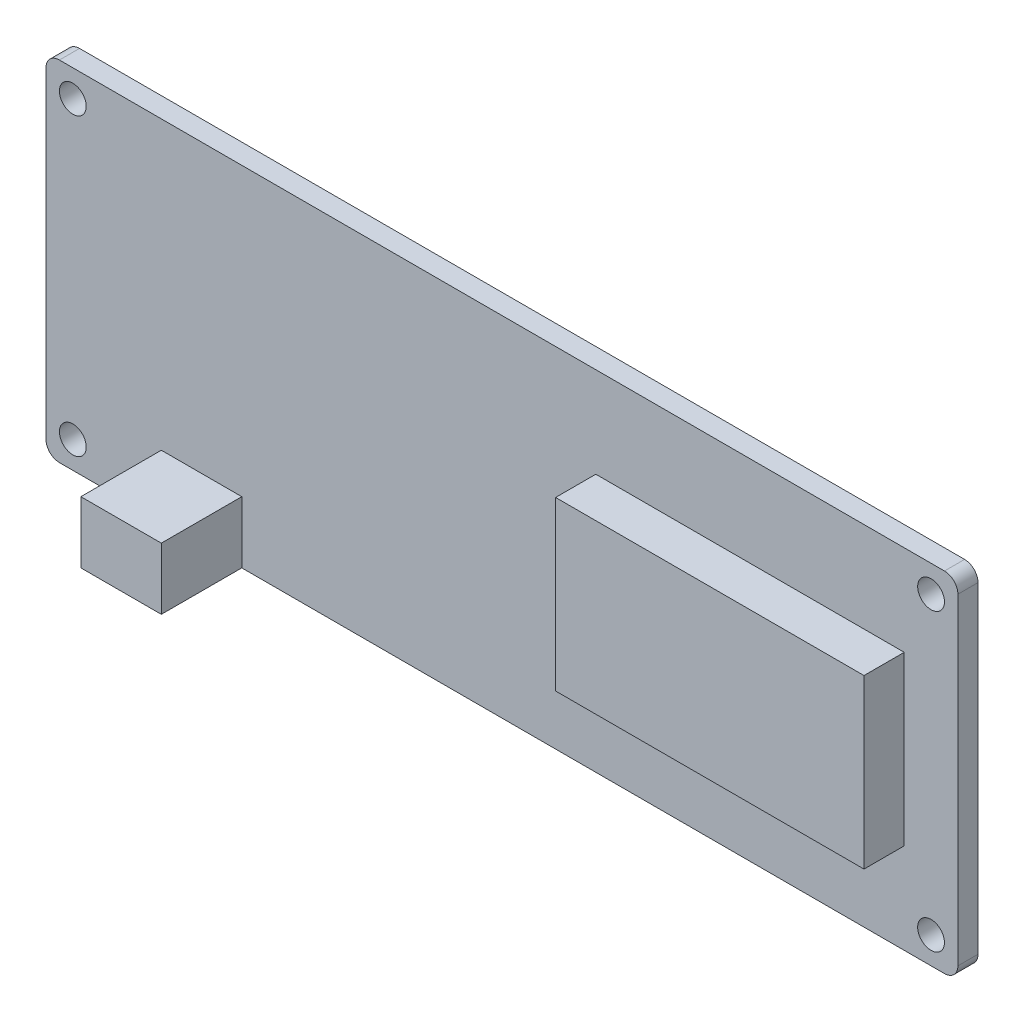
ISO-10303-21;
HEADER;
FILE_DESCRIPTION(('STEP AP214'),'2;1');
FILE_NAME('part.step','',(''),(''),'','','');
FILE_SCHEMA(('AUTOMOTIVE_DESIGN { 1 0 10303 214 1 1 1 1 }'));
ENDSEC;
DATA;
#1=APPLICATION_CONTEXT('core data for automotive mechanical design processes');
#2=APPLICATION_PROTOCOL_DEFINITION('international standard','automotive_design',2000,#1);
#3=PRODUCT_CONTEXT('',#1,'mechanical');
#4=PRODUCT('Part','Part','',(#3));
#5=PRODUCT_RELATED_PRODUCT_CATEGORY('part','',(#4));
#6=PRODUCT_DEFINITION_FORMATION('','',#4);
#7=PRODUCT_DEFINITION_CONTEXT('part definition',#1,'design');
#8=PRODUCT_DEFINITION('design','',#6,#7);
#9=PRODUCT_DEFINITION_SHAPE('','',#8);
#10=(LENGTH_UNIT() NAMED_UNIT(*) SI_UNIT(.MILLI.,.METRE.));
#11=(NAMED_UNIT(*) PLANE_ANGLE_UNIT() SI_UNIT($,.RADIAN.));
#12=(NAMED_UNIT(*) SI_UNIT($,.STERADIAN.) SOLID_ANGLE_UNIT());
#13=UNCERTAINTY_MEASURE_WITH_UNIT(LENGTH_MEASURE(1.E-05),#10,'distance_accuracy_value','');
#14=(GEOMETRIC_REPRESENTATION_CONTEXT(3) GLOBAL_UNCERTAINTY_ASSIGNED_CONTEXT((#13)) GLOBAL_UNIT_ASSIGNED_CONTEXT((#10,
#11,#12)) REPRESENTATION_CONTEXT('',''));
#15=CARTESIAN_POINT('',(0.,0.,0.));
#16=DIRECTION('',(0.,0.,1.));
#17=DIRECTION('',(1.,0.,0.));
#18=AXIS2_PLACEMENT_3D('',#15,#16,#17);
#19=CARTESIAN_POINT('',(32.4983494870785,-33.0565397486196,1.5));
#20=DIRECTION('',(0.,0.,-1.));
#21=DIRECTION('',(-1.,0.,0.));
#22=AXIS2_PLACEMENT_3D('',#19,#20,#21);
#23=PLANE('',#22);
#24=DIRECTION('',(0.,-1.,0.));
#25=VECTOR('',#24,1.);
#26=CARTESIAN_POINT('',(6.49834948707853,-38.8065397486196,1.5));
#27=LINE('',#26,#25);
#28=CARTESIAN_POINT('',(6.49834948707853,-38.8065397486196,1.5));
#29=VERTEX_POINT('',#28);
#30=CARTESIAN_POINT('',(6.49834948707853,-51.3065397486196,1.5));
#31=VERTEX_POINT('',#30);
#32=EDGE_CURVE('E168',#29,#31,#27,.T.);
#33=ORIENTED_EDGE('',*,*,#32,.F.);
#34=DIRECTION('',(-1.,0.,0.));
#35=VECTOR('',#34,1.);
#36=CARTESIAN_POINT('',(6.49834948707853,-38.8065397486196,1.5));
#37=LINE('',#36,#35);
#38=CARTESIAN_POINT('',(29.4983494870785,-38.8065397486196,1.5));
#39=VERTEX_POINT('',#38);
#40=EDGE_CURVE('E181',#39,#29,#37,.T.);
#41=ORIENTED_EDGE('',*,*,#40,.F.);
#42=DIRECTION('',(0.,1.,0.));
#43=VECTOR('',#42,1.);
#44=CARTESIAN_POINT('',(29.4983494870785,-38.8065397486196,1.5));
#45=LINE('',#44,#43);
#46=CARTESIAN_POINT('',(29.4983494870785,-51.3065397486196,1.5));
#47=VERTEX_POINT('',#46);
#48=EDGE_CURVE('E190',#47,#39,#45,.T.);
#49=ORIENTED_EDGE('',*,*,#48,.F.);
#50=DIRECTION('',(1.,0.,0.));
#51=VECTOR('',#50,1.);
#52=CARTESIAN_POINT('',(6.49834948707853,-51.3065397486196,1.5));
#53=LINE('',#52,#51);
#54=EDGE_CURVE('E171',#31,#47,#53,.T.);
#55=ORIENTED_EDGE('',*,*,#54,.F.);
#56=EDGE_LOOP('',(#33,#41,#49,#55));
#57=FACE_BOUND('',#56,.T.);
#58=CARTESIAN_POINT('',(-32.5016505129215,-34.0565397486196,1.5));
#59=DIRECTION('',(0.,0.,1.));
#60=DIRECTION('',(1.,0.,0.));
#61=AXIS2_PLACEMENT_3D('',#58,#59,#60);
#62=CIRCLE('',#61,1.00000000000001);
#63=CARTESIAN_POINT('',(-31.5016505129215,-34.0565397486196,1.5));
#64=VERTEX_POINT('',#63);
#65=EDGE_CURVE('E225',#64,#64,#62,.T.);
#66=ORIENTED_EDGE('',*,*,#65,.F.);
#67=EDGE_LOOP('',(#66));
#68=FACE_BOUND('',#67,.T.);
#69=CARTESIAN_POINT('',(-32.5016505129215,-56.0565397486196,1.5));
#70=DIRECTION('',(0.,0.,1.));
#71=DIRECTION('',(1.,0.,0.));
#72=AXIS2_PLACEMENT_3D('',#69,#70,#71);
#73=CIRCLE('',#72,0.999999999999998);
#74=CARTESIAN_POINT('',(-31.5016505129215,-56.0565397486196,1.5));
#75=VERTEX_POINT('',#74);
#76=EDGE_CURVE('E219',#75,#75,#73,.T.);
#77=ORIENTED_EDGE('',*,*,#76,.F.);
#78=EDGE_LOOP('',(#77));
#79=FACE_BOUND('',#78,.T.);
#80=CARTESIAN_POINT('',(31.4983494870785,-56.0565397486196,1.5));
#81=DIRECTION('',(0.,0.,1.));
#82=DIRECTION('',(1.,0.,0.));
#83=AXIS2_PLACEMENT_3D('',#80,#81,#82);
#84=CIRCLE('',#83,0.999999999999998);
#85=CARTESIAN_POINT('',(32.4983494870785,-56.0565397486196,1.5));
#86=VERTEX_POINT('',#85);
#87=EDGE_CURVE('E213',#86,#86,#84,.T.);
#88=ORIENTED_EDGE('',*,*,#87,.F.);
#89=EDGE_LOOP('',(#88));
#90=FACE_BOUND('',#89,.T.);
#91=CARTESIAN_POINT('',(31.4983494870785,-34.0565397486196,1.5));
#92=DIRECTION('',(0.,0.,1.));
#93=DIRECTION('',(1.,0.,0.));
#94=AXIS2_PLACEMENT_3D('',#91,#92,#93);
#95=CIRCLE('',#94,0.999999999999998);
#96=CARTESIAN_POINT('',(32.4983494870785,-34.0565397486196,1.5));
#97=VERTEX_POINT('',#96);
#98=EDGE_CURVE('E207',#97,#97,#95,.T.);
#99=ORIENTED_EDGE('',*,*,#98,.F.);
#100=EDGE_LOOP('',(#99));
#101=FACE_BOUND('',#100,.T.);
#102=DIRECTION('',(0.,-1.,0.));
#103=VECTOR('',#102,1.);
#104=CARTESIAN_POINT('',(-25.9016505129215,-53.4565397486196,1.5));
#105=LINE('',#104,#103);
#106=CARTESIAN_POINT('',(-25.9016505129215,-53.4565397486196,1.5));
#107=VERTEX_POINT('',#106);
#108=CARTESIAN_POINT('',(-25.9016505129215,-58.0565397486196,1.5));
#109=VERTEX_POINT('',#108);
#110=EDGE_CURVE('E49',#107,#109,#105,.T.);
#111=ORIENTED_EDGE('',*,*,#110,.F.);
#112=DIRECTION('',(-1.,0.,0.));
#113=VECTOR('',#112,1.);
#114=CARTESIAN_POINT('',(-25.9016505129215,-53.4565397486196,1.5));
#115=LINE('',#114,#113);
#116=CARTESIAN_POINT('',(-19.9016505129215,-53.4565397486196,1.5));
#117=VERTEX_POINT('',#116);
#118=EDGE_CURVE('E53',#117,#107,#115,.T.);
#119=ORIENTED_EDGE('',*,*,#118,.F.);
#120=DIRECTION('',(0.,1.,0.));
#121=VECTOR('',#120,1.);
#122=CARTESIAN_POINT('',(-19.9016505129215,-53.4565397486196,1.5));
#123=LINE('',#122,#121);
#124=CARTESIAN_POINT('',(-19.9016505129215,-58.0565397486196,1.5));
#125=VERTEX_POINT('',#124);
#126=EDGE_CURVE('E320',#125,#117,#123,.T.);
#127=ORIENTED_EDGE('',*,*,#126,.F.);
#128=DIRECTION('',(1.,0.,0.));
#129=VECTOR('',#128,1.);
#130=CARTESIAN_POINT('',(-33.5016505129215,-58.0565397486196,1.5));
#131=LINE('',#130,#129);
#132=CARTESIAN_POINT('',(32.4983494870785,-58.0565397486196,1.5));
#133=VERTEX_POINT('',#132);
#134=EDGE_CURVE('E243',#125,#133,#131,.T.);
#135=ORIENTED_EDGE('',*,*,#134,.T.);
#136=CARTESIAN_POINT('',(32.4983494870785,-57.0565397486196,1.5));
#137=DIRECTION('',(0.,0.,1.));
#138=DIRECTION('',(1.,0.,0.));
#139=AXIS2_PLACEMENT_3D('',#136,#137,#138);
#140=CIRCLE('',#139,1.);
#141=CARTESIAN_POINT('',(33.4983494870785,-57.0565397486196,1.5));
#142=VERTEX_POINT('',#141);
#143=EDGE_CURVE('E246',#133,#142,#140,.T.);
#144=ORIENTED_EDGE('',*,*,#143,.T.);
#145=DIRECTION('',(0.,1.,0.));
#146=VECTOR('',#145,1.);
#147=CARTESIAN_POINT('',(33.4983494870785,-57.0565397486195,1.5));
#148=LINE('',#147,#146);
#149=CARTESIAN_POINT('',(33.4983494870785,-33.0565397486196,1.5));
#150=VERTEX_POINT('',#149);
#151=EDGE_CURVE('E248',#142,#150,#148,.T.);
#152=ORIENTED_EDGE('',*,*,#151,.T.);
#153=CARTESIAN_POINT('',(32.4983494870785,-33.0565397486196,1.5));
#154=DIRECTION('',(0.,0.,1.));
#155=DIRECTION('',(-1.,0.,0.));
#156=AXIS2_PLACEMENT_3D('',#153,#154,#155);
#157=CIRCLE('',#156,1.);
#158=CARTESIAN_POINT('',(32.4983494870785,-32.0565397486196,1.5));
#159=VERTEX_POINT('',#158);
#160=EDGE_CURVE('E231',#150,#159,#157,.T.);
#161=ORIENTED_EDGE('',*,*,#160,.T.);
#162=DIRECTION('',(-1.,0.,0.));
#163=VECTOR('',#162,1.);
#164=CARTESIAN_POINT('',(-33.5016505129215,-32.0565397486196,1.5));
#165=LINE('',#164,#163);
#166=CARTESIAN_POINT('',(-33.5016505129215,-32.0565397486196,1.5));
#167=VERTEX_POINT('',#166);
#168=EDGE_CURVE('E234',#159,#167,#165,.T.);
#169=ORIENTED_EDGE('',*,*,#168,.T.);
#170=CARTESIAN_POINT('',(-33.5016505129215,-33.0565397486196,1.5));
#171=DIRECTION('',(0.,0.,1.));
#172=DIRECTION('',(-1.,0.,0.));
#173=AXIS2_PLACEMENT_3D('',#170,#171,#172);
#174=CIRCLE('',#173,1.);
#175=CARTESIAN_POINT('',(-34.5016505129215,-33.0565397486196,1.5));
#176=VERTEX_POINT('',#175);
#177=EDGE_CURVE('E237',#167,#176,#174,.T.);
#178=ORIENTED_EDGE('',*,*,#177,.T.);
#179=DIRECTION('',(0.,-1.,0.));
#180=VECTOR('',#179,1.);
#181=CARTESIAN_POINT('',(-34.5016505129215,-57.0565397486195,1.5));
#182=LINE('',#181,#180);
#183=CARTESIAN_POINT('',(-34.5016505129215,-57.0565397486195,1.5));
#184=VERTEX_POINT('',#183);
#185=EDGE_CURVE('E239',#176,#184,#182,.T.);
#186=ORIENTED_EDGE('',*,*,#185,.T.);
#187=CARTESIAN_POINT('',(-33.5016505129215,-57.0565397486196,1.5));
#188=DIRECTION('',(0.,0.,1.));
#189=DIRECTION('',(-1.,0.,0.));
#190=AXIS2_PLACEMENT_3D('',#187,#188,#189);
#191=CIRCLE('',#190,1.);
#192=CARTESIAN_POINT('',(-33.5016505129215,-58.0565397486196,1.5));
#193=VERTEX_POINT('',#192);
#194=EDGE_CURVE('E241',#184,#193,#191,.T.);
#195=ORIENTED_EDGE('',*,*,#194,.T.);
#196=EDGE_CURVE('E244',#193,#109,#131,.T.);
#197=ORIENTED_EDGE('',*,*,#196,.T.);
#198=EDGE_LOOP('',(#111,#119,#127,#135,#144,#152,#161,#169,#178,#186,#195,#197));
#199=FACE_BOUND('',#198,.T.);
#200=ADVANCED_FACE('F34',(#57,#68,#79,#90,#101,#199),#23,.F.);
#201=CARTESIAN_POINT('',(32.4983494870785,-33.0565397486196,0.));
#202=DIRECTION('',(0.,0.,-1.));
#203=DIRECTION('',(-1.,0.,0.));
#204=AXIS2_PLACEMENT_3D('',#201,#202,#203);
#205=PLANE('',#204);
#206=CARTESIAN_POINT('',(31.4983494870785,-56.0565397486196,0.));
#207=DIRECTION('',(0.,0.,1.));
#208=DIRECTION('',(1.,0.,0.));
#209=AXIS2_PLACEMENT_3D('',#206,#207,#208);
#210=CIRCLE('',#209,0.999999999999998);
#211=CARTESIAN_POINT('',(32.4983494870785,-56.0565397486196,0.));
#212=VERTEX_POINT('',#211);
#213=EDGE_CURVE('E210',#212,#212,#210,.T.);
#214=ORIENTED_EDGE('',*,*,#213,.T.);
#215=EDGE_LOOP('',(#214));
#216=FACE_BOUND('',#215,.T.);
#217=CARTESIAN_POINT('',(-32.5016505129215,-34.0565397486196,0.));
#218=DIRECTION('',(0.,0.,1.));
#219=DIRECTION('',(1.,0.,0.));
#220=AXIS2_PLACEMENT_3D('',#217,#218,#219);
#221=CIRCLE('',#220,1.00000000000001);
#222=CARTESIAN_POINT('',(-31.5016505129215,-34.0565397486196,0.));
#223=VERTEX_POINT('',#222);
#224=EDGE_CURVE('E222',#223,#223,#221,.T.);
#225=ORIENTED_EDGE('',*,*,#224,.T.);
#226=EDGE_LOOP('',(#225));
#227=FACE_BOUND('',#226,.T.);
#228=CARTESIAN_POINT('',(32.4983494870785,-33.0565397486196,0.));
#229=DIRECTION('',(0.,0.,1.));
#230=DIRECTION('',(-1.,0.,0.));
#231=AXIS2_PLACEMENT_3D('',#228,#229,#230);
#232=CIRCLE('',#231,1.);
#233=CARTESIAN_POINT('',(33.4983494870785,-33.0565397486196,0.));
#234=VERTEX_POINT('',#233);
#235=CARTESIAN_POINT('',(32.4983494870785,-32.0565397486196,0.));
#236=VERTEX_POINT('',#235);
#237=EDGE_CURVE('E228',#234,#236,#232,.T.);
#238=ORIENTED_EDGE('',*,*,#237,.F.);
#239=DIRECTION('',(0.,1.,0.));
#240=VECTOR('',#239,1.);
#241=CARTESIAN_POINT('',(33.4983494870785,-57.0565397486195,0.));
#242=LINE('',#241,#240);
#243=CARTESIAN_POINT('',(33.4983494870785,-57.0565397486196,0.));
#244=VERTEX_POINT('',#243);
#245=EDGE_CURVE('E235',#244,#234,#242,.T.);
#246=ORIENTED_EDGE('',*,*,#245,.F.);
#247=CARTESIAN_POINT('',(32.4983494870785,-57.0565397486196,0.));
#248=DIRECTION('',(0.,0.,1.));
#249=DIRECTION('',(1.,0.,0.));
#250=AXIS2_PLACEMENT_3D('',#247,#248,#249);
#251=CIRCLE('',#250,1.);
#252=CARTESIAN_POINT('',(32.4983494870785,-58.0565397486196,0.));
#253=VERTEX_POINT('',#252);
#254=EDGE_CURVE('E263',#253,#244,#251,.T.);
#255=ORIENTED_EDGE('',*,*,#254,.F.);
#256=DIRECTION('',(1.,0.,0.));
#257=VECTOR('',#256,1.);
#258=CARTESIAN_POINT('',(-33.5016505129215,-58.0565397486196,0.));
#259=LINE('',#258,#257);
#260=CARTESIAN_POINT('',(-33.5016505129215,-58.0565397486196,0.));
#261=VERTEX_POINT('',#260);
#262=EDGE_CURVE('E261',#261,#253,#259,.T.);
#263=ORIENTED_EDGE('',*,*,#262,.F.);
#264=CARTESIAN_POINT('',(-33.5016505129215,-57.0565397486196,0.));
#265=DIRECTION('',(0.,0.,1.));
#266=DIRECTION('',(-1.,0.,0.));
#267=AXIS2_PLACEMENT_3D('',#264,#265,#266);
#268=CIRCLE('',#267,1.);
#269=CARTESIAN_POINT('',(-34.5016505129215,-57.0565397486195,0.));
#270=VERTEX_POINT('',#269);
#271=EDGE_CURVE('E259',#270,#261,#268,.T.);
#272=ORIENTED_EDGE('',*,*,#271,.F.);
#273=DIRECTION('',(0.,-1.,0.));
#274=VECTOR('',#273,1.);
#275=CARTESIAN_POINT('',(-34.5016505129215,-57.0565397486195,0.));
#276=LINE('',#275,#274);
#277=CARTESIAN_POINT('',(-34.5016505129215,-33.0565397486196,0.));
#278=VERTEX_POINT('',#277);
#279=EDGE_CURVE('E257',#278,#270,#276,.T.);
#280=ORIENTED_EDGE('',*,*,#279,.F.);
#281=CARTESIAN_POINT('',(-33.5016505129215,-33.0565397486196,0.));
#282=DIRECTION('',(0.,0.,1.));
#283=DIRECTION('',(-1.,0.,0.));
#284=AXIS2_PLACEMENT_3D('',#281,#282,#283);
#285=CIRCLE('',#284,1.);
#286=CARTESIAN_POINT('',(-33.5016505129215,-32.0565397486196,0.));
#287=VERTEX_POINT('',#286);
#288=EDGE_CURVE('E255',#287,#278,#285,.T.);
#289=ORIENTED_EDGE('',*,*,#288,.F.);
#290=DIRECTION('',(-1.,0.,0.));
#291=VECTOR('',#290,1.);
#292=CARTESIAN_POINT('',(-33.5016505129215,-32.0565397486196,0.));
#293=LINE('',#292,#291);
#294=EDGE_CURVE('E253',#236,#287,#293,.T.);
#295=ORIENTED_EDGE('',*,*,#294,.F.);
#296=EDGE_LOOP('',(#238,#246,#255,#263,#272,#280,#289,#295));
#297=FACE_BOUND('',#296,.T.);
#298=CARTESIAN_POINT('',(-32.5016505129215,-56.0565397486196,0.));
#299=DIRECTION('',(0.,0.,1.));
#300=DIRECTION('',(1.,0.,0.));
#301=AXIS2_PLACEMENT_3D('',#298,#299,#300);
#302=CIRCLE('',#301,0.999999999999998);
#303=CARTESIAN_POINT('',(-31.5016505129215,-56.0565397486196,0.));
#304=VERTEX_POINT('',#303);
#305=EDGE_CURVE('E216',#304,#304,#302,.T.);
#306=ORIENTED_EDGE('',*,*,#305,.T.);
#307=EDGE_LOOP('',(#306));
#308=FACE_BOUND('',#307,.T.);
#309=CARTESIAN_POINT('',(31.4983494870785,-34.0565397486196,0.));
#310=DIRECTION('',(0.,0.,1.));
#311=DIRECTION('',(1.,0.,0.));
#312=AXIS2_PLACEMENT_3D('',#309,#310,#311);
#313=CIRCLE('',#312,0.999999999999998);
#314=CARTESIAN_POINT('',(32.4983494870785,-34.0565397486196,0.));
#315=VERTEX_POINT('',#314);
#316=EDGE_CURVE('E206',#315,#315,#313,.T.);
#317=ORIENTED_EDGE('',*,*,#316,.T.);
#318=EDGE_LOOP('',(#317));
#319=FACE_BOUND('',#318,.T.);
#320=ADVANCED_FACE('F293',(#216,#227,#297,#308,#319),#205,.T.);
#321=CARTESIAN_POINT('',(32.4983494870785,-33.0565397486196,1.5));
#322=DIRECTION('',(0.,0.,-1.));
#323=DIRECTION('',(-1.,0.,0.));
#324=AXIS2_PLACEMENT_3D('',#321,#322,#323);
#325=CYLINDRICAL_SURFACE('',#324,1.);
#326=ORIENTED_EDGE('',*,*,#237,.T.);
#327=DIRECTION('',(0.,0.,-1.));
#328=VECTOR('',#327,1.);
#329=CARTESIAN_POINT('',(32.4983494870785,-32.0565397486196,1.5));
#330=LINE('',#329,#328);
#331=EDGE_CURVE('E11',#159,#236,#330,.T.);
#332=ORIENTED_EDGE('',*,*,#331,.F.);
#333=ORIENTED_EDGE('',*,*,#160,.F.);
#334=DIRECTION('',(0.,0.,-1.));
#335=VECTOR('',#334,1.);
#336=CARTESIAN_POINT('',(33.4983494870785,-33.0565397486196,1.5));
#337=LINE('',#336,#335);
#338=EDGE_CURVE('E250',#150,#234,#337,.T.);
#339=ORIENTED_EDGE('',*,*,#338,.T.);
#340=EDGE_LOOP('',(#326,#332,#333,#339));
#341=FACE_BOUND('',#340,.T.);
#342=ADVANCED_FACE('F36',(#341),#325,.T.);
#343=CARTESIAN_POINT('',(-33.5016505129215,-32.0565397486196,1.5));
#344=DIRECTION('',(0.,-1.,0.));
#345=DIRECTION('',(0.,0.,-1.));
#346=AXIS2_PLACEMENT_3D('',#343,#344,#345);
#347=PLANE('',#346);
#348=ORIENTED_EDGE('',*,*,#294,.T.);
#349=DIRECTION('',(0.,0.,-1.));
#350=VECTOR('',#349,1.);
#351=CARTESIAN_POINT('',(-33.5016505129215,-32.0565397486196,1.5));
#352=LINE('',#351,#350);
#353=EDGE_CURVE('E42',#167,#287,#352,.T.);
#354=ORIENTED_EDGE('',*,*,#353,.F.);
#355=ORIENTED_EDGE('',*,*,#168,.F.);
#356=ORIENTED_EDGE('',*,*,#331,.T.);
#357=EDGE_LOOP('',(#348,#354,#355,#356));
#358=FACE_BOUND('',#357,.T.);
#359=ADVANCED_FACE('F307',(#358),#347,.F.);
#360=CARTESIAN_POINT('',(-33.5016505129215,-33.0565397486196,1.5));
#361=DIRECTION('',(0.,0.,-1.));
#362=DIRECTION('',(-1.,0.,0.));
#363=AXIS2_PLACEMENT_3D('',#360,#361,#362);
#364=CYLINDRICAL_SURFACE('',#363,1.);
#365=ORIENTED_EDGE('',*,*,#288,.T.);
#366=DIRECTION('',(0.,0.,-1.));
#367=VECTOR('',#366,1.);
#368=CARTESIAN_POINT('',(-34.5016505129215,-33.0565397486196,1.5));
#369=LINE('',#368,#367);
#370=EDGE_CURVE('E280',#176,#278,#369,.T.);
#371=ORIENTED_EDGE('',*,*,#370,.F.);
#372=ORIENTED_EDGE('',*,*,#177,.F.);
#373=ORIENTED_EDGE('',*,*,#353,.T.);
#374=EDGE_LOOP('',(#365,#371,#372,#373));
#375=FACE_BOUND('',#374,.T.);
#376=ADVANCED_FACE('F287',(#375),#364,.T.);
#377=CARTESIAN_POINT('',(-34.5016505129215,-57.0565397486195,1.5));
#378=DIRECTION('',(1.,0.,0.));
#379=DIRECTION('',(0.,0.,-1.));
#380=AXIS2_PLACEMENT_3D('',#377,#378,#379);
#381=PLANE('',#380);
#382=ORIENTED_EDGE('',*,*,#279,.T.);
#383=DIRECTION('',(0.,0.,-1.));
#384=VECTOR('',#383,1.);
#385=CARTESIAN_POINT('',(-34.5016505129215,-57.0565397486195,1.5));
#386=LINE('',#385,#384);
#387=EDGE_CURVE('E277',#184,#270,#386,.T.);
#388=ORIENTED_EDGE('',*,*,#387,.F.);
#389=ORIENTED_EDGE('',*,*,#185,.F.);
#390=ORIENTED_EDGE('',*,*,#370,.T.);
#391=EDGE_LOOP('',(#382,#388,#389,#390));
#392=FACE_BOUND('',#391,.T.);
#393=ADVANCED_FACE('F299',(#392),#381,.F.);
#394=CARTESIAN_POINT('',(-33.5016505129215,-57.0565397486196,1.5));
#395=DIRECTION('',(0.,0.,-1.));
#396=DIRECTION('',(-1.,0.,0.));
#397=AXIS2_PLACEMENT_3D('',#394,#395,#396);
#398=CYLINDRICAL_SURFACE('',#397,1.);
#399=ORIENTED_EDGE('',*,*,#271,.T.);
#400=DIRECTION('',(0.,0.,-1.));
#401=VECTOR('',#400,1.);
#402=CARTESIAN_POINT('',(-33.5016505129215,-58.0565397486196,1.5));
#403=LINE('',#402,#401);
#404=EDGE_CURVE('E274',#193,#261,#403,.T.);
#405=ORIENTED_EDGE('',*,*,#404,.F.);
#406=ORIENTED_EDGE('',*,*,#194,.F.);
#407=ORIENTED_EDGE('',*,*,#387,.T.);
#408=EDGE_LOOP('',(#399,#405,#406,#407));
#409=FACE_BOUND('',#408,.T.);
#410=ADVANCED_FACE('F303',(#409),#398,.T.);
#411=CARTESIAN_POINT('',(-33.5016505129215,-58.0565397486196,1.5));
#412=DIRECTION('',(0.,1.,0.));
#413=DIRECTION('',(0.,0.,1.));
#414=AXIS2_PLACEMENT_3D('',#411,#412,#413);
#415=PLANE('',#414);
#416=ORIENTED_EDGE('',*,*,#262,.T.);
#417=DIRECTION('',(0.,0.,-1.));
#418=VECTOR('',#417,1.);
#419=CARTESIAN_POINT('',(32.4983494870785,-58.0565397486196,1.5));
#420=LINE('',#419,#418);
#421=EDGE_CURVE('E271',#133,#253,#420,.T.);
#422=ORIENTED_EDGE('',*,*,#421,.F.);
#423=ORIENTED_EDGE('',*,*,#134,.F.);
#424=DIRECTION('',(0.,0.,-1.));
#425=VECTOR('',#424,1.);
#426=CARTESIAN_POINT('',(-19.9016505129215,-58.0565397486196,7.5));
#427=LINE('',#426,#425);
#428=CARTESIAN_POINT('',(-19.9016505129215,-58.0565397486196,7.5));
#429=VERTEX_POINT('',#428);
#430=EDGE_CURVE('E153',#429,#125,#427,.T.);
#431=ORIENTED_EDGE('',*,*,#430,.F.);
#432=DIRECTION('',(1.,0.,0.));
#433=VECTOR('',#432,1.);
#434=CARTESIAN_POINT('',(-25.9016505129215,-58.0565397486196,7.5));
#435=LINE('',#434,#433);
#436=CARTESIAN_POINT('',(-25.9016505129215,-58.0565397486196,7.5));
#437=VERTEX_POINT('',#436);
#438=EDGE_CURVE('E146',#437,#429,#435,.T.);
#439=ORIENTED_EDGE('',*,*,#438,.F.);
#440=DIRECTION('',(0.,0.,-1.));
#441=VECTOR('',#440,1.);
#442=CARTESIAN_POINT('',(-25.9016505129215,-58.0565397486196,7.5));
#443=LINE('',#442,#441);
#444=EDGE_CURVE('E151',#437,#109,#443,.T.);
#445=ORIENTED_EDGE('',*,*,#444,.T.);
#446=ORIENTED_EDGE('',*,*,#196,.F.);
#447=ORIENTED_EDGE('',*,*,#404,.T.);
#448=EDGE_LOOP('',(#416,#422,#423,#431,#439,#445,#446,#447));
#449=FACE_BOUND('',#448,.T.);
#450=ADVANCED_FACE('F148',(#449),#415,.F.);
#451=CARTESIAN_POINT('',(32.4983494870785,-57.0565397486196,1.5));
#452=DIRECTION('',(0.,0.,-1.));
#453=DIRECTION('',(-1.,0.,0.));
#454=AXIS2_PLACEMENT_3D('',#451,#452,#453);
#455=CYLINDRICAL_SURFACE('',#454,1.);
#456=ORIENTED_EDGE('',*,*,#254,.T.);
#457=DIRECTION('',(0.,0.,-1.));
#458=VECTOR('',#457,1.);
#459=CARTESIAN_POINT('',(33.4983494870785,-57.0565397486196,1.5));
#460=LINE('',#459,#458);
#461=EDGE_CURVE('E268',#142,#244,#460,.T.);
#462=ORIENTED_EDGE('',*,*,#461,.F.);
#463=ORIENTED_EDGE('',*,*,#143,.F.);
#464=ORIENTED_EDGE('',*,*,#421,.T.);
#465=EDGE_LOOP('',(#456,#462,#463,#464));
#466=FACE_BOUND('',#465,.T.);
#467=ADVANCED_FACE('F318',(#466),#455,.T.);
#468=CARTESIAN_POINT('',(33.4983494870785,-57.0565397486195,1.5));
#469=DIRECTION('',(-1.,0.,0.));
#470=DIRECTION('',(0.,0.,1.));
#471=AXIS2_PLACEMENT_3D('',#468,#469,#470);
#472=PLANE('',#471);
#473=ORIENTED_EDGE('',*,*,#245,.T.);
#474=ORIENTED_EDGE('',*,*,#338,.F.);
#475=ORIENTED_EDGE('',*,*,#151,.F.);
#476=ORIENTED_EDGE('',*,*,#461,.T.);
#477=EDGE_LOOP('',(#473,#474,#475,#476));
#478=FACE_BOUND('',#477,.T.);
#479=ADVANCED_FACE('F313',(#478),#472,.F.);
#480=CARTESIAN_POINT('',(-32.5016505129215,-34.0565397486196,1.5));
#481=DIRECTION('',(0.,0.,-1.));
#482=DIRECTION('',(-1.,0.,0.));
#483=AXIS2_PLACEMENT_3D('',#480,#481,#482);
#484=CYLINDRICAL_SURFACE('',#483,1.00000000000001);
#485=ORIENTED_EDGE('',*,*,#65,.T.);
#486=EDGE_LOOP('',(#485));
#487=FACE_BOUND('',#486,.T.);
#488=ORIENTED_EDGE('',*,*,#224,.F.);
#489=EDGE_LOOP('',(#488));
#490=FACE_BOUND('',#489,.T.);
#491=ADVANCED_FACE('F352',(#487,#490),#484,.F.);
#492=CARTESIAN_POINT('',(-32.5016505129215,-56.0565397486196,1.5));
#493=DIRECTION('',(0.,0.,-1.));
#494=DIRECTION('',(-1.,0.,0.));
#495=AXIS2_PLACEMENT_3D('',#492,#493,#494);
#496=CYLINDRICAL_SURFACE('',#495,0.999999999999998);
#497=ORIENTED_EDGE('',*,*,#76,.T.);
#498=EDGE_LOOP('',(#497));
#499=FACE_BOUND('',#498,.T.);
#500=ORIENTED_EDGE('',*,*,#305,.F.);
#501=EDGE_LOOP('',(#500));
#502=FACE_BOUND('',#501,.T.);
#503=ADVANCED_FACE('F426',(#499,#502),#496,.F.);
#504=CARTESIAN_POINT('',(31.4983494870785,-56.0565397486196,1.5));
#505=DIRECTION('',(0.,0.,-1.));
#506=DIRECTION('',(-1.,0.,0.));
#507=AXIS2_PLACEMENT_3D('',#504,#505,#506);
#508=CYLINDRICAL_SURFACE('',#507,0.999999999999998);
#509=ORIENTED_EDGE('',*,*,#87,.T.);
#510=EDGE_LOOP('',(#509));
#511=FACE_BOUND('',#510,.T.);
#512=ORIENTED_EDGE('',*,*,#213,.F.);
#513=EDGE_LOOP('',(#512));
#514=FACE_BOUND('',#513,.T.);
#515=ADVANCED_FACE('F434',(#511,#514),#508,.F.);
#516=CARTESIAN_POINT('',(31.4983494870785,-34.0565397486196,1.5));
#517=DIRECTION('',(0.,0.,-1.));
#518=DIRECTION('',(-1.,0.,0.));
#519=AXIS2_PLACEMENT_3D('',#516,#517,#518);
#520=CYLINDRICAL_SURFACE('',#519,0.999999999999998);
#521=ORIENTED_EDGE('',*,*,#98,.T.);
#522=EDGE_LOOP('',(#521));
#523=FACE_BOUND('',#522,.T.);
#524=ORIENTED_EDGE('',*,*,#316,.F.);
#525=EDGE_LOOP('',(#524));
#526=FACE_BOUND('',#525,.T.);
#527=ADVANCED_FACE('F442',(#523,#526),#520,.F.);
#528=CARTESIAN_POINT('',(6.49834948707853,-38.8065397486196,4.5));
#529=DIRECTION('',(1.,0.,0.));
#530=DIRECTION('',(0.,1.,0.));
#531=AXIS2_PLACEMENT_3D('',#528,#529,#530);
#532=PLANE('',#531);
#533=ORIENTED_EDGE('',*,*,#32,.T.);
#534=DIRECTION('',(0.,0.,-1.));
#535=VECTOR('',#534,1.);
#536=CARTESIAN_POINT('',(6.49834948707853,-51.3065397486196,4.5));
#537=LINE('',#536,#535);
#538=CARTESIAN_POINT('',(6.49834948707853,-51.3065397486196,4.5));
#539=VERTEX_POINT('',#538);
#540=EDGE_CURVE('E203',#539,#31,#537,.T.);
#541=ORIENTED_EDGE('',*,*,#540,.F.);
#542=DIRECTION('',(0.,-1.,0.));
#543=VECTOR('',#542,1.);
#544=CARTESIAN_POINT('',(6.49834948707853,-38.8065397486196,4.5));
#545=LINE('',#544,#543);
#546=CARTESIAN_POINT('',(6.49834948707853,-38.8065397486196,4.5));
#547=VERTEX_POINT('',#546);
#548=EDGE_CURVE('E177',#547,#539,#545,.T.);
#549=ORIENTED_EDGE('',*,*,#548,.F.);
#550=DIRECTION('',(0.,0.,-1.));
#551=VECTOR('',#550,1.);
#552=CARTESIAN_POINT('',(6.49834948707853,-38.8065397486196,4.5));
#553=LINE('',#552,#551);
#554=EDGE_CURVE('E186',#547,#29,#553,.T.);
#555=ORIENTED_EDGE('',*,*,#554,.T.);
#556=EDGE_LOOP('',(#533,#541,#549,#555));
#557=FACE_BOUND('',#556,.T.);
#558=ADVANCED_FACE('F451',(#557),#532,.F.);
#559=CARTESIAN_POINT('',(6.49834948707853,-51.3065397486196,4.5));
#560=DIRECTION('',(0.,1.,0.));
#561=DIRECTION('',(0.,0.,1.));
#562=AXIS2_PLACEMENT_3D('',#559,#560,#561);
#563=PLANE('',#562);
#564=ORIENTED_EDGE('',*,*,#54,.T.);
#565=DIRECTION('',(0.,0.,-1.));
#566=VECTOR('',#565,1.);
#567=CARTESIAN_POINT('',(29.4983494870785,-51.3065397486196,4.5));
#568=LINE('',#567,#566);
#569=CARTESIAN_POINT('',(29.4983494870785,-51.3065397486196,4.5));
#570=VERTEX_POINT('',#569);
#571=EDGE_CURVE('E200',#570,#47,#568,.T.);
#572=ORIENTED_EDGE('',*,*,#571,.F.);
#573=DIRECTION('',(1.,0.,0.));
#574=VECTOR('',#573,1.);
#575=CARTESIAN_POINT('',(6.49834948707853,-51.3065397486196,4.5));
#576=LINE('',#575,#574);
#577=EDGE_CURVE('E180',#539,#570,#576,.T.);
#578=ORIENTED_EDGE('',*,*,#577,.F.);
#579=ORIENTED_EDGE('',*,*,#540,.T.);
#580=EDGE_LOOP('',(#564,#572,#578,#579));
#581=FACE_BOUND('',#580,.T.);
#582=ADVANCED_FACE('F460',(#581),#563,.F.);
#583=CARTESIAN_POINT('',(29.4983494870785,-38.8065397486196,4.5));
#584=DIRECTION('',(-1.,0.,0.));
#585=DIRECTION('',(0.,-1.,0.));
#586=AXIS2_PLACEMENT_3D('',#583,#584,#585);
#587=PLANE('',#586);
#588=ORIENTED_EDGE('',*,*,#48,.T.);
#589=DIRECTION('',(0.,0.,-1.));
#590=VECTOR('',#589,1.);
#591=CARTESIAN_POINT('',(29.4983494870785,-38.8065397486196,4.5));
#592=LINE('',#591,#590);
#593=CARTESIAN_POINT('',(29.4983494870785,-38.8065397486196,4.5));
#594=VERTEX_POINT('',#593);
#595=EDGE_CURVE('E197',#594,#39,#592,.T.);
#596=ORIENTED_EDGE('',*,*,#595,.F.);
#597=DIRECTION('',(0.,1.,0.));
#598=VECTOR('',#597,1.);
#599=CARTESIAN_POINT('',(29.4983494870785,-38.8065397486196,4.5));
#600=LINE('',#599,#598);
#601=EDGE_CURVE('E183',#570,#594,#600,.T.);
#602=ORIENTED_EDGE('',*,*,#601,.F.);
#603=ORIENTED_EDGE('',*,*,#571,.T.);
#604=EDGE_LOOP('',(#588,#596,#602,#603));
#605=FACE_BOUND('',#604,.T.);
#606=ADVANCED_FACE('F469',(#605),#587,.F.);
#607=CARTESIAN_POINT('',(6.49834948707853,-38.8065397486196,4.5));
#608=DIRECTION('',(0.,-1.,0.));
#609=DIRECTION('',(0.,0.,-1.));
#610=AXIS2_PLACEMENT_3D('',#607,#608,#609);
#611=PLANE('',#610);
#612=ORIENTED_EDGE('',*,*,#40,.T.);
#613=ORIENTED_EDGE('',*,*,#554,.F.);
#614=DIRECTION('',(-1.,0.,0.));
#615=VECTOR('',#614,1.);
#616=CARTESIAN_POINT('',(6.49834948707853,-38.8065397486196,4.5));
#617=LINE('',#616,#615);
#618=EDGE_CURVE('E185',#594,#547,#617,.T.);
#619=ORIENTED_EDGE('',*,*,#618,.F.);
#620=ORIENTED_EDGE('',*,*,#595,.T.);
#621=EDGE_LOOP('',(#612,#613,#619,#620));
#622=FACE_BOUND('',#621,.T.);
#623=ADVANCED_FACE('F478',(#622),#611,.F.);
#624=CARTESIAN_POINT('',(0.,0.,4.5));
#625=DIRECTION('',(0.,0.,1.));
#626=DIRECTION('',(1.,0.,0.));
#627=AXIS2_PLACEMENT_3D('',#624,#625,#626);
#628=PLANE('',#627);
#629=ORIENTED_EDGE('',*,*,#548,.T.);
#630=ORIENTED_EDGE('',*,*,#577,.T.);
#631=ORIENTED_EDGE('',*,*,#601,.T.);
#632=ORIENTED_EDGE('',*,*,#618,.T.);
#633=EDGE_LOOP('',(#629,#630,#631,#632));
#634=FACE_BOUND('',#633,.T.);
#635=ADVANCED_FACE('F487',(#634),#628,.T.);
#636=CARTESIAN_POINT('',(-25.9016505129215,-53.4565397486196,7.5));
#637=DIRECTION('',(1.,0.,0.));
#638=DIRECTION('',(0.,0.,-1.));
#639=AXIS2_PLACEMENT_3D('',#636,#637,#638);
#640=PLANE('',#639);
#641=ORIENTED_EDGE('',*,*,#110,.T.);
#642=ORIENTED_EDGE('',*,*,#444,.F.);
#643=DIRECTION('',(0.,-1.,0.));
#644=VECTOR('',#643,1.);
#645=CARTESIAN_POINT('',(-25.9016505129215,-53.4565397486196,7.5));
#646=LINE('',#645,#644);
#647=CARTESIAN_POINT('',(-25.9016505129215,-53.4565397486196,7.5));
#648=VERTEX_POINT('',#647);
#649=EDGE_CURVE('E157',#648,#437,#646,.T.);
#650=ORIENTED_EDGE('',*,*,#649,.F.);
#651=DIRECTION('',(0.,0.,-1.));
#652=VECTOR('',#651,1.);
#653=CARTESIAN_POINT('',(-25.9016505129215,-53.4565397486196,7.5));
#654=LINE('',#653,#652);
#655=EDGE_CURVE('E327',#648,#107,#654,.T.);
#656=ORIENTED_EDGE('',*,*,#655,.T.);
#657=EDGE_LOOP('',(#641,#642,#650,#656));
#658=FACE_BOUND('',#657,.T.);
#659=ADVANCED_FACE('F167',(#658),#640,.F.);
#660=CARTESIAN_POINT('',(-19.9016505129215,-53.4565397486196,7.5));
#661=DIRECTION('',(-1.,0.,0.));
#662=DIRECTION('',(0.,0.,1.));
#663=AXIS2_PLACEMENT_3D('',#660,#661,#662);
#664=PLANE('',#663);
#665=ORIENTED_EDGE('',*,*,#126,.T.);
#666=DIRECTION('',(0.,0.,-1.));
#667=VECTOR('',#666,1.);
#668=CARTESIAN_POINT('',(-19.9016505129215,-53.4565397486196,7.5));
#669=LINE('',#668,#667);
#670=CARTESIAN_POINT('',(-19.9016505129215,-53.4565397486196,7.5));
#671=VERTEX_POINT('',#670);
#672=EDGE_CURVE('E173',#671,#117,#669,.T.);
#673=ORIENTED_EDGE('',*,*,#672,.F.);
#674=DIRECTION('',(0.,1.,0.));
#675=VECTOR('',#674,1.);
#676=CARTESIAN_POINT('',(-19.9016505129215,-53.4565397486196,7.5));
#677=LINE('',#676,#675);
#678=EDGE_CURVE('E156',#429,#671,#677,.T.);
#679=ORIENTED_EDGE('',*,*,#678,.F.);
#680=ORIENTED_EDGE('',*,*,#430,.T.);
#681=EDGE_LOOP('',(#665,#673,#679,#680));
#682=FACE_BOUND('',#681,.T.);
#683=ADVANCED_FACE('F325',(#682),#664,.F.);
#684=CARTESIAN_POINT('',(-25.9016505129215,-53.4565397486196,7.5));
#685=DIRECTION('',(0.,-1.,0.));
#686=DIRECTION('',(1.,0.,0.));
#687=AXIS2_PLACEMENT_3D('',#684,#685,#686);
#688=PLANE('',#687);
#689=ORIENTED_EDGE('',*,*,#118,.T.);
#690=ORIENTED_EDGE('',*,*,#655,.F.);
#691=DIRECTION('',(-1.,0.,0.));
#692=VECTOR('',#691,1.);
#693=CARTESIAN_POINT('',(-25.9016505129215,-53.4565397486196,7.5));
#694=LINE('',#693,#692);
#695=EDGE_CURVE('E162',#671,#648,#694,.T.);
#696=ORIENTED_EDGE('',*,*,#695,.F.);
#697=ORIENTED_EDGE('',*,*,#672,.T.);
#698=EDGE_LOOP('',(#689,#690,#696,#697));
#699=FACE_BOUND('',#698,.T.);
#700=ADVANCED_FACE('F333',(#699),#688,.F.);
#701=CARTESIAN_POINT('',(0.,0.,7.5));
#702=DIRECTION('',(0.,0.,1.));
#703=DIRECTION('',(1.,0.,0.));
#704=AXIS2_PLACEMENT_3D('',#701,#702,#703);
#705=PLANE('',#704);
#706=ORIENTED_EDGE('',*,*,#649,.T.);
#707=ORIENTED_EDGE('',*,*,#438,.T.);
#708=ORIENTED_EDGE('',*,*,#678,.T.);
#709=ORIENTED_EDGE('',*,*,#695,.T.);
#710=EDGE_LOOP('',(#706,#707,#708,#709));
#711=FACE_BOUND('',#710,.T.);
#712=ADVANCED_FACE('F160',(#711),#705,.T.);
#713=CLOSED_SHELL('',(#200,#320,#342,#359,#376,#393,#410,#450,#467,#479,#491,#503,#515,#527,
#558,#582,#606,#623,#635,#659,#683,#700,#712));
#714=MANIFOLD_SOLID_BREP('B2',#713);
#715=ADVANCED_BREP_SHAPE_REPRESENTATION('',(#18,#714),#14);
#716=SHAPE_DEFINITION_REPRESENTATION(#9,#715);
ENDSEC;
END-ISO-10303-21;
